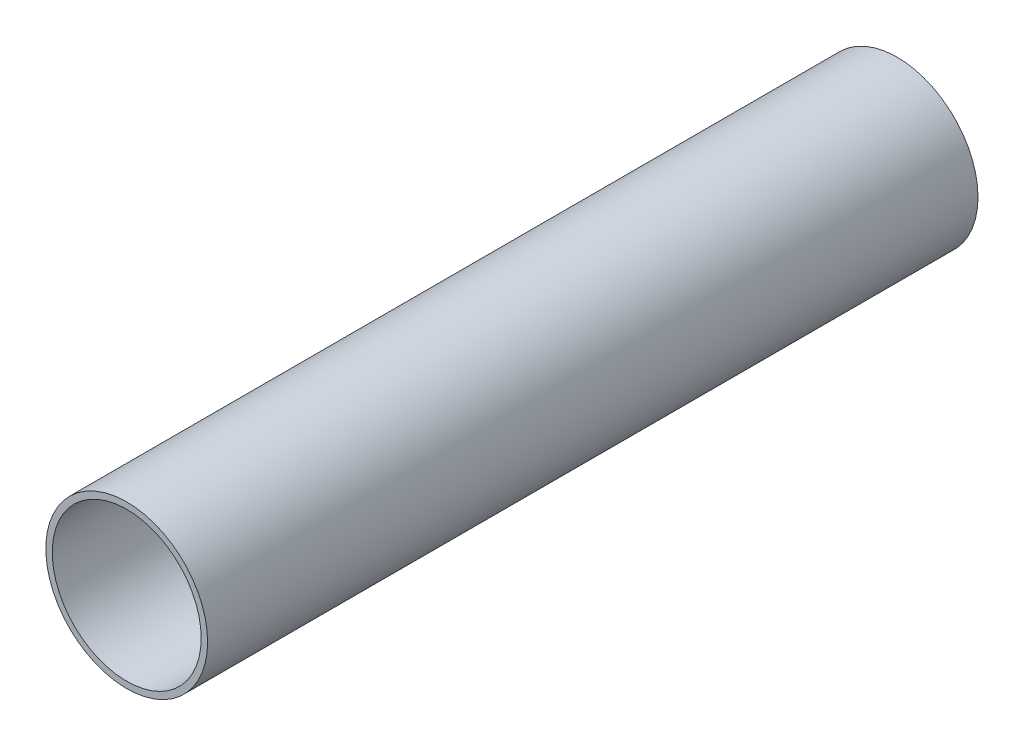
ISO-10303-21;
HEADER;
FILE_DESCRIPTION(('STEP AP214'),'2;1');
FILE_NAME('part.step','',(''),(''),'','','');
FILE_SCHEMA(('AUTOMOTIVE_DESIGN { 1 0 10303 214 1 1 1 1 }'));
ENDSEC;
DATA;
#1=APPLICATION_CONTEXT('core data for automotive mechanical design processes');
#2=APPLICATION_PROTOCOL_DEFINITION('international standard','automotive_design',2000,#1);
#3=PRODUCT_CONTEXT('',#1,'mechanical');
#4=PRODUCT('Part','Part','',(#3));
#5=PRODUCT_RELATED_PRODUCT_CATEGORY('part','',(#4));
#6=PRODUCT_DEFINITION_FORMATION('','',#4);
#7=PRODUCT_DEFINITION_CONTEXT('part definition',#1,'design');
#8=PRODUCT_DEFINITION('design','',#6,#7);
#9=PRODUCT_DEFINITION_SHAPE('','',#8);
#10=(LENGTH_UNIT() NAMED_UNIT(*) SI_UNIT(.MILLI.,.METRE.));
#11=(NAMED_UNIT(*) PLANE_ANGLE_UNIT() SI_UNIT($,.RADIAN.));
#12=(NAMED_UNIT(*) SI_UNIT($,.STERADIAN.) SOLID_ANGLE_UNIT());
#13=UNCERTAINTY_MEASURE_WITH_UNIT(LENGTH_MEASURE(1.E-05),#10,'distance_accuracy_value','');
#14=(GEOMETRIC_REPRESENTATION_CONTEXT(3) GLOBAL_UNCERTAINTY_ASSIGNED_CONTEXT((#13)) GLOBAL_UNIT_ASSIGNED_CONTEXT((#10,
#11,#12)) REPRESENTATION_CONTEXT('',''));
#15=CARTESIAN_POINT('',(0.,0.,0.));
#16=DIRECTION('',(0.,0.,1.));
#17=DIRECTION('',(1.,0.,0.));
#18=AXIS2_PLACEMENT_3D('',#15,#16,#17);
#19=CARTESIAN_POINT('',(0.,0.,300.));
#20=DIRECTION('',(0.,0.,1.));
#21=DIRECTION('',(1.,0.,0.));
#22=AXIS2_PLACEMENT_3D('',#19,#20,#21);
#23=PLANE('',#22);
#24=CARTESIAN_POINT('',(0.,0.,300.));
#25=DIRECTION('',(0.,0.,1.));
#26=DIRECTION('',(1.,0.,0.));
#27=AXIS2_PLACEMENT_3D('',#24,#25,#26);
#28=CIRCLE('',#27,31.5);
#29=CARTESIAN_POINT('',(31.5,0.,300.));
#30=VERTEX_POINT('',#29);
#31=EDGE_CURVE('E10',#30,#30,#28,.T.);
#32=ORIENTED_EDGE('',*,*,#31,.T.);
#33=EDGE_LOOP('',(#32));
#34=FACE_BOUND('',#33,.T.);
#35=CARTESIAN_POINT('',(0.,0.,300.));
#36=DIRECTION('',(0.,0.,1.));
#37=DIRECTION('',(1.,0.,0.));
#38=AXIS2_PLACEMENT_3D('',#35,#36,#37);
#39=CIRCLE('',#38,29.);
#40=CARTESIAN_POINT('',(29.,0.,300.));
#41=VERTEX_POINT('',#40);
#42=EDGE_CURVE('E42',#41,#41,#39,.T.);
#43=ORIENTED_EDGE('',*,*,#42,.F.);
#44=EDGE_LOOP('',(#43));
#45=FACE_BOUND('',#44,.T.);
#46=ADVANCED_FACE('F31',(#34,#45),#23,.T.);
#47=CARTESIAN_POINT('',(0.,0.,0.));
#48=DIRECTION('',(0.,0.,1.));
#49=DIRECTION('',(1.,0.,0.));
#50=AXIS2_PLACEMENT_3D('',#47,#48,#49);
#51=PLANE('',#50);
#52=CARTESIAN_POINT('',(0.,0.,0.));
#53=DIRECTION('',(0.,0.,1.));
#54=DIRECTION('',(1.,0.,0.));
#55=AXIS2_PLACEMENT_3D('',#52,#53,#54);
#56=CIRCLE('',#55,31.5);
#57=CARTESIAN_POINT('',(31.5,0.,0.));
#58=VERTEX_POINT('',#57);
#59=EDGE_CURVE('E35',#58,#58,#56,.T.);
#60=ORIENTED_EDGE('',*,*,#59,.F.);
#61=EDGE_LOOP('',(#60));
#62=FACE_BOUND('',#61,.T.);
#63=CARTESIAN_POINT('',(0.,0.,0.));
#64=DIRECTION('',(0.,0.,1.));
#65=DIRECTION('',(1.,0.,0.));
#66=AXIS2_PLACEMENT_3D('',#63,#64,#65);
#67=CIRCLE('',#66,29.);
#68=CARTESIAN_POINT('',(29.,0.,0.));
#69=VERTEX_POINT('',#68);
#70=EDGE_CURVE('E44',#69,#69,#67,.T.);
#71=ORIENTED_EDGE('',*,*,#70,.T.);
#72=EDGE_LOOP('',(#71));
#73=FACE_BOUND('',#72,.T.);
#74=ADVANCED_FACE('F54',(#62,#73),#51,.F.);
#75=CARTESIAN_POINT('',(0.,0.,300.));
#76=DIRECTION('',(0.,0.,-1.));
#77=DIRECTION('',(-1.,0.,0.));
#78=AXIS2_PLACEMENT_3D('',#75,#76,#77);
#79=CYLINDRICAL_SURFACE('',#78,31.5);
#80=ORIENTED_EDGE('',*,*,#31,.F.);
#81=EDGE_LOOP('',(#80));
#82=FACE_BOUND('',#81,.T.);
#83=ORIENTED_EDGE('',*,*,#59,.T.);
#84=EDGE_LOOP('',(#83));
#85=FACE_BOUND('',#84,.T.);
#86=ADVANCED_FACE('F33',(#82,#85),#79,.T.);
#87=CARTESIAN_POINT('',(0.,0.,300.));
#88=DIRECTION('',(0.,0.,-1.));
#89=DIRECTION('',(-1.,0.,0.));
#90=AXIS2_PLACEMENT_3D('',#87,#88,#89);
#91=CYLINDRICAL_SURFACE('',#90,29.);
#92=ORIENTED_EDGE('',*,*,#42,.T.);
#93=EDGE_LOOP('',(#92));
#94=FACE_BOUND('',#93,.T.);
#95=ORIENTED_EDGE('',*,*,#70,.F.);
#96=EDGE_LOOP('',(#95));
#97=FACE_BOUND('',#96,.T.);
#98=ADVANCED_FACE('F50',(#94,#97),#91,.F.);
#99=CLOSED_SHELL('',(#46,#74,#86,#98));
#100=MANIFOLD_SOLID_BREP('B2',#99);
#101=ADVANCED_BREP_SHAPE_REPRESENTATION('',(#18,#100),#14);
#102=SHAPE_DEFINITION_REPRESENTATION(#9,#101);
ENDSEC;
END-ISO-10303-21;
